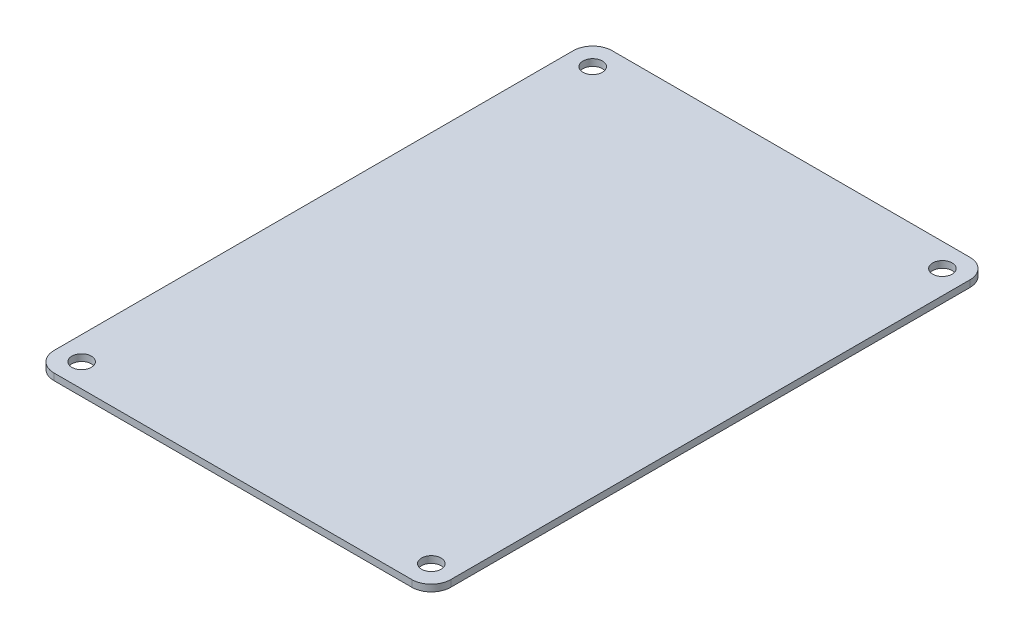
ISO-10303-21;
HEADER;
FILE_DESCRIPTION(('STEP AP214'),'2;1');
FILE_NAME('part.step','',(''),(''),'','','');
FILE_SCHEMA(('AUTOMOTIVE_DESIGN { 1 0 10303 214 1 1 1 1 }'));
ENDSEC;
DATA;
#1=APPLICATION_CONTEXT('core data for automotive mechanical design processes');
#2=APPLICATION_PROTOCOL_DEFINITION('international standard','automotive_design',2000,#1);
#3=PRODUCT_CONTEXT('',#1,'mechanical');
#4=PRODUCT('Part','Part','',(#3));
#5=PRODUCT_RELATED_PRODUCT_CATEGORY('part','',(#4));
#6=PRODUCT_DEFINITION_FORMATION('','',#4);
#7=PRODUCT_DEFINITION_CONTEXT('part definition',#1,'design');
#8=PRODUCT_DEFINITION('design','',#6,#7);
#9=PRODUCT_DEFINITION_SHAPE('','',#8);
#10=(LENGTH_UNIT() NAMED_UNIT(*) SI_UNIT(.MILLI.,.METRE.));
#11=(NAMED_UNIT(*) PLANE_ANGLE_UNIT() SI_UNIT($,.RADIAN.));
#12=(NAMED_UNIT(*) SI_UNIT($,.STERADIAN.) SOLID_ANGLE_UNIT());
#13=UNCERTAINTY_MEASURE_WITH_UNIT(LENGTH_MEASURE(1.E-05),#10,'distance_accuracy_value','');
#14=(GEOMETRIC_REPRESENTATION_CONTEXT(3) GLOBAL_UNCERTAINTY_ASSIGNED_CONTEXT((#13)) GLOBAL_UNIT_ASSIGNED_CONTEXT((#10,
#11,#12)) REPRESENTATION_CONTEXT('',''));
#15=CARTESIAN_POINT('',(0.,0.,0.));
#16=DIRECTION('',(0.,0.,1.));
#17=DIRECTION('',(1.,0.,0.));
#18=AXIS2_PLACEMENT_3D('',#15,#16,#17);
#19=CARTESIAN_POINT('',(-26.6,1.,-38.6));
#20=DIRECTION('',(0.,-1.,0.));
#21=DIRECTION('',(0.,0.,-1.));
#22=AXIS2_PLACEMENT_3D('',#19,#20,#21);
#23=PLANE('',#22);
#24=CARTESIAN_POINT('',(-26.6,1.,-38.6));
#25=DIRECTION('',(0.,1.,0.));
#26=DIRECTION('',(0.,0.,-1.));
#27=AXIS2_PLACEMENT_3D('',#24,#25,#26);
#28=CIRCLE('',#27,2.89999999999999);
#29=CARTESIAN_POINT('',(-26.6,1.,-41.5));
#30=VERTEX_POINT('',#29);
#31=CARTESIAN_POINT('',(-29.5,1.,-38.6));
#32=VERTEX_POINT('',#31);
#33=EDGE_CURVE('E145',#30,#32,#28,.T.);
#34=ORIENTED_EDGE('',*,*,#33,.T.);
#35=DIRECTION('',(0.,0.,1.));
#36=VECTOR('',#35,1.);
#37=CARTESIAN_POINT('',(-29.5,1.,-38.6));
#38=LINE('',#37,#36);
#39=CARTESIAN_POINT('',(-29.5,1.,38.6));
#40=VERTEX_POINT('',#39);
#41=EDGE_CURVE('E93',#32,#40,#38,.T.);
#42=ORIENTED_EDGE('',*,*,#41,.T.);
#43=CARTESIAN_POINT('',(-26.6,1.,38.6));
#44=DIRECTION('',(0.,1.,0.));
#45=DIRECTION('',(0.,0.,-1.));
#46=AXIS2_PLACEMENT_3D('',#43,#44,#45);
#47=CIRCLE('',#46,2.89999999999999);
#48=CARTESIAN_POINT('',(-26.6,1.,41.5));
#49=VERTEX_POINT('',#48);
#50=EDGE_CURVE('E160',#40,#49,#47,.T.);
#51=ORIENTED_EDGE('',*,*,#50,.T.);
#52=DIRECTION('',(1.,0.,0.));
#53=VECTOR('',#52,1.);
#54=CARTESIAN_POINT('',(-26.6,1.,41.5));
#55=LINE('',#54,#53);
#56=CARTESIAN_POINT('',(26.6,1.,41.5));
#57=VERTEX_POINT('',#56);
#58=EDGE_CURVE('E173',#49,#57,#55,.T.);
#59=ORIENTED_EDGE('',*,*,#58,.T.);
#60=CARTESIAN_POINT('',(26.6,1.,38.6));
#61=DIRECTION('',(0.,1.,0.));
#62=DIRECTION('',(0.,0.,-1.));
#63=AXIS2_PLACEMENT_3D('',#60,#61,#62);
#64=CIRCLE('',#63,2.9);
#65=CARTESIAN_POINT('',(29.5,1.,38.6));
#66=VERTEX_POINT('',#65);
#67=EDGE_CURVE('E112',#57,#66,#64,.T.);
#68=ORIENTED_EDGE('',*,*,#67,.T.);
#69=DIRECTION('',(0.,0.,-1.));
#70=VECTOR('',#69,1.);
#71=CARTESIAN_POINT('',(29.5,1.,38.6));
#72=LINE('',#71,#70);
#73=CARTESIAN_POINT('',(29.5,1.,-38.6));
#74=VERTEX_POINT('',#73);
#75=EDGE_CURVE('E106',#66,#74,#72,.T.);
#76=ORIENTED_EDGE('',*,*,#75,.T.);
#77=CARTESIAN_POINT('',(26.6,1.,-38.6));
#78=DIRECTION('',(0.,1.,0.));
#79=DIRECTION('',(0.,0.,-1.));
#80=AXIS2_PLACEMENT_3D('',#77,#78,#79);
#81=CIRCLE('',#80,2.89999999999999);
#82=CARTESIAN_POINT('',(26.6,1.,-41.5));
#83=VERTEX_POINT('',#82);
#84=EDGE_CURVE('E110',#74,#83,#81,.T.);
#85=ORIENTED_EDGE('',*,*,#84,.T.);
#86=DIRECTION('',(-1.,0.,0.));
#87=VECTOR('',#86,1.);
#88=CARTESIAN_POINT('',(-26.6,1.,-41.5));
#89=LINE('',#88,#87);
#90=EDGE_CURVE('E50',#83,#30,#89,.T.);
#91=ORIENTED_EDGE('',*,*,#90,.T.);
#92=EDGE_LOOP('',(#34,#42,#51,#59,#68,#76,#85,#91));
#93=FACE_BOUND('',#92,.T.);
#94=CARTESIAN_POINT('',(-26.,1.,-38.));
#95=DIRECTION('',(0.,1.,0.));
#96=DIRECTION('',(0.,0.,1.));
#97=AXIS2_PLACEMENT_3D('',#94,#95,#96);
#98=CIRCLE('',#97,1.45);
#99=CARTESIAN_POINT('',(-26.,1.,-36.55));
#100=VERTEX_POINT('',#99);
#101=EDGE_CURVE('E134',#100,#100,#98,.T.);
#102=ORIENTED_EDGE('',*,*,#101,.F.);
#103=EDGE_LOOP('',(#102));
#104=FACE_BOUND('',#103,.T.);
#105=CARTESIAN_POINT('',(26.,1.,-38.));
#106=DIRECTION('',(0.,1.,0.));
#107=DIRECTION('',(0.,0.,1.));
#108=AXIS2_PLACEMENT_3D('',#105,#106,#107);
#109=CIRCLE('',#108,1.45);
#110=CARTESIAN_POINT('',(26.,1.,-36.55));
#111=VERTEX_POINT('',#110);
#112=EDGE_CURVE('E182',#111,#111,#109,.T.);
#113=ORIENTED_EDGE('',*,*,#112,.F.);
#114=EDGE_LOOP('',(#113));
#115=FACE_BOUND('',#114,.T.);
#116=CARTESIAN_POINT('',(26.,1.,38.));
#117=DIRECTION('',(0.,1.,0.));
#118=DIRECTION('',(0.,0.,1.));
#119=AXIS2_PLACEMENT_3D('',#116,#117,#118);
#120=CIRCLE('',#119,1.45);
#121=CARTESIAN_POINT('',(26.,1.,39.45));
#122=VERTEX_POINT('',#121);
#123=EDGE_CURVE('E188',#122,#122,#120,.T.);
#124=ORIENTED_EDGE('',*,*,#123,.F.);
#125=EDGE_LOOP('',(#124));
#126=FACE_BOUND('',#125,.T.);
#127=CARTESIAN_POINT('',(-26.,1.,38.));
#128=DIRECTION('',(0.,1.,0.));
#129=DIRECTION('',(0.,0.,1.));
#130=AXIS2_PLACEMENT_3D('',#127,#128,#129);
#131=CIRCLE('',#130,1.45);
#132=CARTESIAN_POINT('',(-26.,1.,39.45));
#133=VERTEX_POINT('',#132);
#134=EDGE_CURVE('E194',#133,#133,#131,.T.);
#135=ORIENTED_EDGE('',*,*,#134,.F.);
#136=EDGE_LOOP('',(#135));
#137=FACE_BOUND('',#136,.T.);
#138=ADVANCED_FACE('F33',(#93,#104,#115,#126,#137),#23,.F.);
#139=CARTESIAN_POINT('',(-26.6,0.,-38.6));
#140=DIRECTION('',(0.,-1.,0.));
#141=DIRECTION('',(0.,0.,-1.));
#142=AXIS2_PLACEMENT_3D('',#139,#140,#141);
#143=PLANE('',#142);
#144=CARTESIAN_POINT('',(26.,0.,38.));
#145=DIRECTION('',(0.,1.,0.));
#146=DIRECTION('',(0.,0.,1.));
#147=AXIS2_PLACEMENT_3D('',#144,#145,#146);
#148=CIRCLE('',#147,1.45);
#149=CARTESIAN_POINT('',(26.,0.,39.45));
#150=VERTEX_POINT('',#149);
#151=EDGE_CURVE('E191',#150,#150,#148,.T.);
#152=ORIENTED_EDGE('',*,*,#151,.T.);
#153=EDGE_LOOP('',(#152));
#154=FACE_BOUND('',#153,.T.);
#155=CARTESIAN_POINT('',(-26.,0.,-38.));
#156=DIRECTION('',(0.,1.,0.));
#157=DIRECTION('',(0.,0.,1.));
#158=AXIS2_PLACEMENT_3D('',#155,#156,#157);
#159=CIRCLE('',#158,1.45);
#160=CARTESIAN_POINT('',(-26.,0.,-36.55));
#161=VERTEX_POINT('',#160);
#162=EDGE_CURVE('E179',#161,#161,#159,.T.);
#163=ORIENTED_EDGE('',*,*,#162,.T.);
#164=EDGE_LOOP('',(#163));
#165=FACE_BOUND('',#164,.T.);
#166=CARTESIAN_POINT('',(-26.6,0.,-38.6));
#167=DIRECTION('',(0.,1.,0.));
#168=DIRECTION('',(0.,0.,-1.));
#169=AXIS2_PLACEMENT_3D('',#166,#167,#168);
#170=CIRCLE('',#169,2.89999999999999);
#171=CARTESIAN_POINT('',(-26.6,0.,-41.5));
#172=VERTEX_POINT('',#171);
#173=CARTESIAN_POINT('',(-29.5,0.,-38.6));
#174=VERTEX_POINT('',#173);
#175=EDGE_CURVE('E130',#172,#174,#170,.T.);
#176=ORIENTED_EDGE('',*,*,#175,.F.);
#177=DIRECTION('',(-1.,0.,0.));
#178=VECTOR('',#177,1.);
#179=CARTESIAN_POINT('',(-26.6,0.,-41.5));
#180=LINE('',#179,#178);
#181=CARTESIAN_POINT('',(26.6,0.,-41.5));
#182=VERTEX_POINT('',#181);
#183=EDGE_CURVE('E85',#182,#172,#180,.T.);
#184=ORIENTED_EDGE('',*,*,#183,.F.);
#185=CARTESIAN_POINT('',(26.6,0.,-38.6));
#186=DIRECTION('',(0.,1.,0.));
#187=DIRECTION('',(0.,0.,-1.));
#188=AXIS2_PLACEMENT_3D('',#185,#186,#187);
#189=CIRCLE('',#188,2.89999999999999);
#190=CARTESIAN_POINT('',(29.5,0.,-38.6));
#191=VERTEX_POINT('',#190);
#192=EDGE_CURVE('E79',#191,#182,#189,.T.);
#193=ORIENTED_EDGE('',*,*,#192,.F.);
#194=DIRECTION('',(0.,0.,-1.));
#195=VECTOR('',#194,1.);
#196=CARTESIAN_POINT('',(29.5,0.,38.6));
#197=LINE('',#196,#195);
#198=CARTESIAN_POINT('',(29.5,0.,38.6));
#199=VERTEX_POINT('',#198);
#200=EDGE_CURVE('E120',#199,#191,#197,.T.);
#201=ORIENTED_EDGE('',*,*,#200,.F.);
#202=CARTESIAN_POINT('',(26.6,0.,38.6));
#203=DIRECTION('',(0.,1.,0.));
#204=DIRECTION('',(0.,0.,-1.));
#205=AXIS2_PLACEMENT_3D('',#202,#203,#204);
#206=CIRCLE('',#205,2.9);
#207=CARTESIAN_POINT('',(26.6,0.,41.5));
#208=VERTEX_POINT('',#207);
#209=EDGE_CURVE('E140',#208,#199,#206,.T.);
#210=ORIENTED_EDGE('',*,*,#209,.F.);
#211=DIRECTION('',(1.,0.,0.));
#212=VECTOR('',#211,1.);
#213=CARTESIAN_POINT('',(-26.6,0.,41.5));
#214=LINE('',#213,#212);
#215=CARTESIAN_POINT('',(-26.6,0.,41.5));
#216=VERTEX_POINT('',#215);
#217=EDGE_CURVE('E138',#216,#208,#214,.T.);
#218=ORIENTED_EDGE('',*,*,#217,.F.);
#219=CARTESIAN_POINT('',(-26.6,0.,38.6));
#220=DIRECTION('',(0.,1.,0.));
#221=DIRECTION('',(0.,0.,-1.));
#222=AXIS2_PLACEMENT_3D('',#219,#220,#221);
#223=CIRCLE('',#222,2.89999999999999);
#224=CARTESIAN_POINT('',(-29.5,0.,38.6));
#225=VERTEX_POINT('',#224);
#226=EDGE_CURVE('E136',#225,#216,#223,.T.);
#227=ORIENTED_EDGE('',*,*,#226,.F.);
#228=DIRECTION('',(0.,0.,1.));
#229=VECTOR('',#228,1.);
#230=CARTESIAN_POINT('',(-29.5,0.,-38.6));
#231=LINE('',#230,#229);
#232=EDGE_CURVE('E133',#174,#225,#231,.T.);
#233=ORIENTED_EDGE('',*,*,#232,.F.);
#234=EDGE_LOOP('',(#176,#184,#193,#201,#210,#218,#227,#233));
#235=FACE_BOUND('',#234,.T.);
#236=CARTESIAN_POINT('',(26.,0.,-38.));
#237=DIRECTION('',(0.,1.,0.));
#238=DIRECTION('',(0.,0.,1.));
#239=AXIS2_PLACEMENT_3D('',#236,#237,#238);
#240=CIRCLE('',#239,1.45);
#241=CARTESIAN_POINT('',(26.,0.,-36.55));
#242=VERTEX_POINT('',#241);
#243=EDGE_CURVE('E185',#242,#242,#240,.T.);
#244=ORIENTED_EDGE('',*,*,#243,.T.);
#245=EDGE_LOOP('',(#244));
#246=FACE_BOUND('',#245,.T.);
#247=CARTESIAN_POINT('',(-26.,0.,38.));
#248=DIRECTION('',(0.,1.,0.));
#249=DIRECTION('',(0.,0.,1.));
#250=AXIS2_PLACEMENT_3D('',#247,#248,#249);
#251=CIRCLE('',#250,1.45);
#252=CARTESIAN_POINT('',(-26.,0.,39.45));
#253=VERTEX_POINT('',#252);
#254=EDGE_CURVE('E197',#253,#253,#251,.T.);
#255=ORIENTED_EDGE('',*,*,#254,.T.);
#256=EDGE_LOOP('',(#255));
#257=FACE_BOUND('',#256,.T.);
#258=ADVANCED_FACE('F164',(#154,#165,#235,#246,#257),#143,.T.);
#259=CARTESIAN_POINT('',(-26.6,1.,-38.6));
#260=DIRECTION('',(0.,-1.,0.));
#261=DIRECTION('',(0.,0.,-1.));
#262=AXIS2_PLACEMENT_3D('',#259,#260,#261);
#263=CYLINDRICAL_SURFACE('',#262,2.89999999999999);
#264=ORIENTED_EDGE('',*,*,#175,.T.);
#265=DIRECTION('',(0.,-1.,0.));
#266=VECTOR('',#265,1.);
#267=CARTESIAN_POINT('',(-29.5,1.,-38.6));
#268=LINE('',#267,#266);
#269=EDGE_CURVE('E11',#32,#174,#268,.T.);
#270=ORIENTED_EDGE('',*,*,#269,.F.);
#271=ORIENTED_EDGE('',*,*,#33,.F.);
#272=DIRECTION('',(0.,-1.,0.));
#273=VECTOR('',#272,1.);
#274=CARTESIAN_POINT('',(-26.6,1.,-41.5));
#275=LINE('',#274,#273);
#276=EDGE_CURVE('E126',#30,#172,#275,.T.);
#277=ORIENTED_EDGE('',*,*,#276,.T.);
#278=EDGE_LOOP('',(#264,#270,#271,#277));
#279=FACE_BOUND('',#278,.T.);
#280=ADVANCED_FACE('F35',(#279),#263,.T.);
#281=CARTESIAN_POINT('',(-29.5,1.,-38.6));
#282=DIRECTION('',(1.,0.,0.));
#283=DIRECTION('',(0.,0.,-1.));
#284=AXIS2_PLACEMENT_3D('',#281,#282,#283);
#285=PLANE('',#284);
#286=ORIENTED_EDGE('',*,*,#232,.T.);
#287=DIRECTION('',(0.,-1.,0.));
#288=VECTOR('',#287,1.);
#289=CARTESIAN_POINT('',(-29.5,1.,38.6));
#290=LINE('',#289,#288);
#291=EDGE_CURVE('E42',#40,#225,#290,.T.);
#292=ORIENTED_EDGE('',*,*,#291,.F.);
#293=ORIENTED_EDGE('',*,*,#41,.F.);
#294=ORIENTED_EDGE('',*,*,#269,.T.);
#295=EDGE_LOOP('',(#286,#292,#293,#294));
#296=FACE_BOUND('',#295,.T.);
#297=ADVANCED_FACE('F229',(#296),#285,.F.);
#298=CARTESIAN_POINT('',(-26.6,1.,38.6));
#299=DIRECTION('',(0.,-1.,0.));
#300=DIRECTION('',(0.,0.,-1.));
#301=AXIS2_PLACEMENT_3D('',#298,#299,#300);
#302=CYLINDRICAL_SURFACE('',#301,2.89999999999999);
#303=ORIENTED_EDGE('',*,*,#226,.T.);
#304=DIRECTION('',(0.,-1.,0.));
#305=VECTOR('',#304,1.);
#306=CARTESIAN_POINT('',(-26.6,1.,41.5));
#307=LINE('',#306,#305);
#308=EDGE_CURVE('E152',#49,#216,#307,.T.);
#309=ORIENTED_EDGE('',*,*,#308,.F.);
#310=ORIENTED_EDGE('',*,*,#50,.F.);
#311=ORIENTED_EDGE('',*,*,#291,.T.);
#312=EDGE_LOOP('',(#303,#309,#310,#311));
#313=FACE_BOUND('',#312,.T.);
#314=ADVANCED_FACE('F158',(#313),#302,.T.);
#315=CARTESIAN_POINT('',(-26.6,1.,41.5));
#316=DIRECTION('',(0.,0.,-1.));
#317=DIRECTION('',(-1.,0.,0.));
#318=AXIS2_PLACEMENT_3D('',#315,#316,#317);
#319=PLANE('',#318);
#320=ORIENTED_EDGE('',*,*,#217,.T.);
#321=DIRECTION('',(0.,-1.,0.));
#322=VECTOR('',#321,1.);
#323=CARTESIAN_POINT('',(26.6,1.,41.5));
#324=LINE('',#323,#322);
#325=EDGE_CURVE('E149',#57,#208,#324,.T.);
#326=ORIENTED_EDGE('',*,*,#325,.F.);
#327=ORIENTED_EDGE('',*,*,#58,.F.);
#328=ORIENTED_EDGE('',*,*,#308,.T.);
#329=EDGE_LOOP('',(#320,#326,#327,#328));
#330=FACE_BOUND('',#329,.T.);
#331=ADVANCED_FACE('F169',(#330),#319,.F.);
#332=CARTESIAN_POINT('',(26.6,1.,38.6));
#333=DIRECTION('',(0.,-1.,0.));
#334=DIRECTION('',(0.,0.,-1.));
#335=AXIS2_PLACEMENT_3D('',#332,#333,#334);
#336=CYLINDRICAL_SURFACE('',#335,2.9);
#337=ORIENTED_EDGE('',*,*,#209,.T.);
#338=DIRECTION('',(0.,-1.,0.));
#339=VECTOR('',#338,1.);
#340=CARTESIAN_POINT('',(29.5,1.,38.6));
#341=LINE('',#340,#339);
#342=EDGE_CURVE('E121',#66,#199,#341,.T.);
#343=ORIENTED_EDGE('',*,*,#342,.F.);
#344=ORIENTED_EDGE('',*,*,#67,.F.);
#345=ORIENTED_EDGE('',*,*,#325,.T.);
#346=EDGE_LOOP('',(#337,#343,#344,#345));
#347=FACE_BOUND('',#346,.T.);
#348=ADVANCED_FACE('F172',(#347),#336,.T.);
#349=CARTESIAN_POINT('',(29.5,1.,38.6));
#350=DIRECTION('',(-1.,0.,0.));
#351=DIRECTION('',(0.,0.,1.));
#352=AXIS2_PLACEMENT_3D('',#349,#350,#351);
#353=PLANE('',#352);
#354=ORIENTED_EDGE('',*,*,#200,.T.);
#355=DIRECTION('',(0.,-1.,0.));
#356=VECTOR('',#355,1.);
#357=CARTESIAN_POINT('',(29.5,1.,-38.6));
#358=LINE('',#357,#356);
#359=EDGE_CURVE('E117',#74,#191,#358,.T.);
#360=ORIENTED_EDGE('',*,*,#359,.F.);
#361=ORIENTED_EDGE('',*,*,#75,.F.);
#362=ORIENTED_EDGE('',*,*,#342,.T.);
#363=EDGE_LOOP('',(#354,#360,#361,#362));
#364=FACE_BOUND('',#363,.T.);
#365=ADVANCED_FACE('F118',(#364),#353,.F.);
#366=CARTESIAN_POINT('',(26.6,1.,-38.6));
#367=DIRECTION('',(0.,-1.,0.));
#368=DIRECTION('',(0.,0.,-1.));
#369=AXIS2_PLACEMENT_3D('',#366,#367,#368);
#370=CYLINDRICAL_SURFACE('',#369,2.89999999999999);
#371=ORIENTED_EDGE('',*,*,#192,.T.);
#372=DIRECTION('',(0.,-1.,0.));
#373=VECTOR('',#372,1.);
#374=CARTESIAN_POINT('',(26.6,1.,-41.5));
#375=LINE('',#374,#373);
#376=EDGE_CURVE('E122',#83,#182,#375,.T.);
#377=ORIENTED_EDGE('',*,*,#376,.F.);
#378=ORIENTED_EDGE('',*,*,#84,.F.);
#379=ORIENTED_EDGE('',*,*,#359,.T.);
#380=EDGE_LOOP('',(#371,#377,#378,#379));
#381=FACE_BOUND('',#380,.T.);
#382=ADVANCED_FACE('F124',(#381),#370,.T.);
#383=CARTESIAN_POINT('',(-26.6,1.,-41.5));
#384=DIRECTION('',(0.,0.,1.));
#385=DIRECTION('',(1.,0.,0.));
#386=AXIS2_PLACEMENT_3D('',#383,#384,#385);
#387=PLANE('',#386);
#388=ORIENTED_EDGE('',*,*,#183,.T.);
#389=ORIENTED_EDGE('',*,*,#276,.F.);
#390=ORIENTED_EDGE('',*,*,#90,.F.);
#391=ORIENTED_EDGE('',*,*,#376,.T.);
#392=EDGE_LOOP('',(#388,#389,#390,#391));
#393=FACE_BOUND('',#392,.T.);
#394=ADVANCED_FACE('F217',(#393),#387,.F.);
#395=CARTESIAN_POINT('',(-26.,1.,-38.));
#396=DIRECTION('',(0.,-1.,0.));
#397=DIRECTION('',(0.,0.,-1.));
#398=AXIS2_PLACEMENT_3D('',#395,#396,#397);
#399=CYLINDRICAL_SURFACE('',#398,1.45);
#400=ORIENTED_EDGE('',*,*,#101,.T.);
#401=EDGE_LOOP('',(#400));
#402=FACE_BOUND('',#401,.T.);
#403=ORIENTED_EDGE('',*,*,#162,.F.);
#404=EDGE_LOOP('',(#403));
#405=FACE_BOUND('',#404,.T.);
#406=ADVANCED_FACE('F214',(#402,#405),#399,.F.);
#407=CARTESIAN_POINT('',(26.,1.,-38.));
#408=DIRECTION('',(0.,-1.,0.));
#409=DIRECTION('',(0.,0.,-1.));
#410=AXIS2_PLACEMENT_3D('',#407,#408,#409);
#411=CYLINDRICAL_SURFACE('',#410,1.45);
#412=ORIENTED_EDGE('',*,*,#112,.T.);
#413=EDGE_LOOP('',(#412));
#414=FACE_BOUND('',#413,.T.);
#415=ORIENTED_EDGE('',*,*,#243,.F.);
#416=EDGE_LOOP('',(#415));
#417=FACE_BOUND('',#416,.T.);
#418=ADVANCED_FACE('F293',(#414,#417),#411,.F.);
#419=CARTESIAN_POINT('',(26.,1.,38.));
#420=DIRECTION('',(0.,-1.,0.));
#421=DIRECTION('',(0.,0.,-1.));
#422=AXIS2_PLACEMENT_3D('',#419,#420,#421);
#423=CYLINDRICAL_SURFACE('',#422,1.45);
#424=ORIENTED_EDGE('',*,*,#123,.T.);
#425=EDGE_LOOP('',(#424));
#426=FACE_BOUND('',#425,.T.);
#427=ORIENTED_EDGE('',*,*,#151,.F.);
#428=EDGE_LOOP('',(#427));
#429=FACE_BOUND('',#428,.T.);
#430=ADVANCED_FACE('F301',(#426,#429),#423,.F.);
#431=CARTESIAN_POINT('',(-26.,1.,38.));
#432=DIRECTION('',(0.,-1.,0.));
#433=DIRECTION('',(0.,0.,-1.));
#434=AXIS2_PLACEMENT_3D('',#431,#432,#433);
#435=CYLINDRICAL_SURFACE('',#434,1.45);
#436=ORIENTED_EDGE('',*,*,#134,.T.);
#437=EDGE_LOOP('',(#436));
#438=FACE_BOUND('',#437,.T.);
#439=ORIENTED_EDGE('',*,*,#254,.F.);
#440=EDGE_LOOP('',(#439));
#441=FACE_BOUND('',#440,.T.);
#442=ADVANCED_FACE('F203',(#438,#441),#435,.F.);
#443=CLOSED_SHELL('',(#138,#258,#280,#297,#314,#331,#348,#365,#382,#394,#406,#418,#430,#442));
#444=MANIFOLD_SOLID_BREP('B2',#443);
#445=ADVANCED_BREP_SHAPE_REPRESENTATION('',(#18,#444),#14);
#446=SHAPE_DEFINITION_REPRESENTATION(#9,#445);
ENDSEC;
END-ISO-10303-21;
